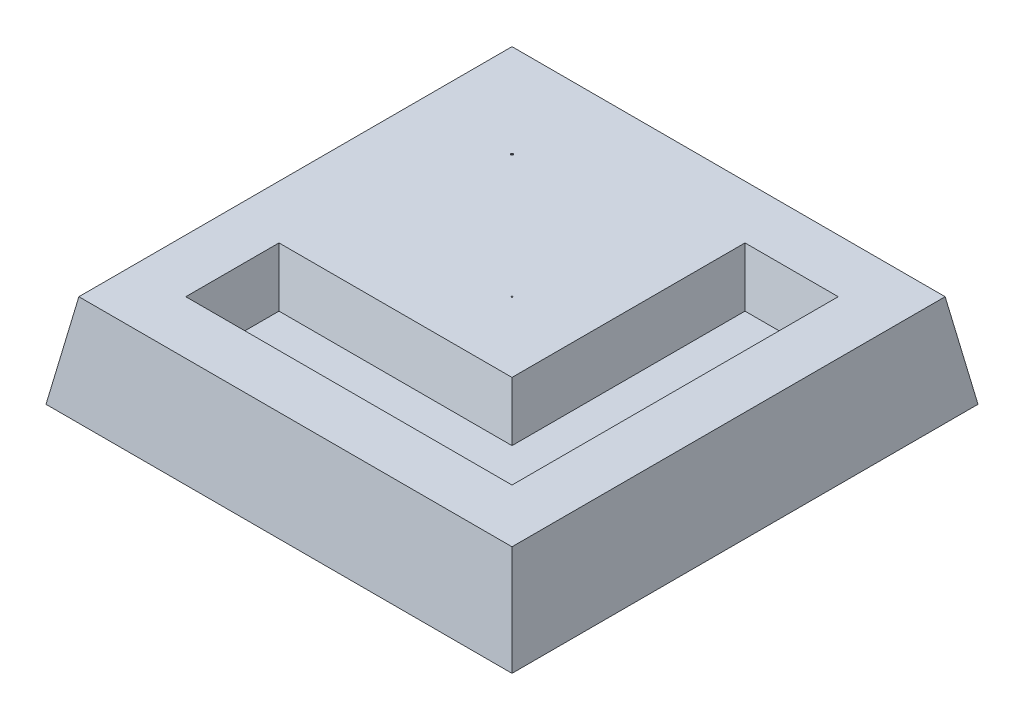
ISO-10303-21;
HEADER;
FILE_DESCRIPTION(('STEP AP214'),'2;1');
FILE_NAME('part.step','',(''),(''),'','','');
FILE_SCHEMA(('AUTOMOTIVE_DESIGN { 1 0 10303 214 1 1 1 1 }'));
ENDSEC;
DATA;
#1=APPLICATION_CONTEXT('core data for automotive mechanical design processes');
#2=APPLICATION_PROTOCOL_DEFINITION('international standard','automotive_design',2000,#1);
#3=PRODUCT_CONTEXT('',#1,'mechanical');
#4=PRODUCT('Part','Part','',(#3));
#5=PRODUCT_RELATED_PRODUCT_CATEGORY('part','',(#4));
#6=PRODUCT_DEFINITION_FORMATION('','',#4);
#7=PRODUCT_DEFINITION_CONTEXT('part definition',#1,'design');
#8=PRODUCT_DEFINITION('design','',#6,#7);
#9=PRODUCT_DEFINITION_SHAPE('','',#8);
#10=(LENGTH_UNIT() NAMED_UNIT(*) SI_UNIT(.MILLI.,.METRE.));
#11=(NAMED_UNIT(*) PLANE_ANGLE_UNIT() SI_UNIT($,.RADIAN.));
#12=(NAMED_UNIT(*) SI_UNIT($,.STERADIAN.) SOLID_ANGLE_UNIT());
#13=UNCERTAINTY_MEASURE_WITH_UNIT(LENGTH_MEASURE(1.E-05),#10,'distance_accuracy_value','');
#14=(GEOMETRIC_REPRESENTATION_CONTEXT(3) GLOBAL_UNCERTAINTY_ASSIGNED_CONTEXT((#13)) GLOBAL_UNIT_ASSIGNED_CONTEXT((#10,
#11,#12)) REPRESENTATION_CONTEXT('',''));
#15=CARTESIAN_POINT('',(0.,0.,0.));
#16=DIRECTION('',(0.,0.,1.));
#17=DIRECTION('',(1.,0.,0.));
#18=AXIS2_PLACEMENT_3D('',#15,#16,#17);
#19=CARTESIAN_POINT('',(1270.,0.,1270.));
#20=DIRECTION('',(0.984807753012208,0.173648177666931,0.));
#21=DIRECTION('',(-0.173648177666931,0.984807753012208,0.));
#22=AXIS2_PLACEMENT_3D('',#19,#20,#21);
#23=PLANE('',#22);
#24=DIRECTION('',(0.,0.,-1.));
#25=VECTOR('',#24,1.);
#26=CARTESIAN_POINT('',(1270.,0.,1270.));
#27=LINE('',#26,#25);
#28=CARTESIAN_POINT('',(1270.,0.,1270.));
#29=VERTEX_POINT('',#28);
#30=CARTESIAN_POINT('',(1270.,0.,-1270.));
#31=VERTEX_POINT('',#30);
#32=EDGE_CURVE('E159',#29,#31,#27,.T.);
#33=ORIENTED_EDGE('',*,*,#32,.T.);
#34=DIRECTION('',(0.171087869746036,-0.970287525247814,-0.171087869746036));
#35=VECTOR('',#34,1.);
#36=CARTESIAN_POINT('',(1195.65150969744,421.651241368936,-1195.65150969744));
#37=LINE('',#36,#35);
#38=CARTESIAN_POINT('',(1180.4258938001,508.,-1180.4258938001));
#39=VERTEX_POINT('',#38);
#40=EDGE_CURVE('E11',#39,#31,#37,.T.);
#41=ORIENTED_EDGE('',*,*,#40,.F.);
#42=DIRECTION('',(0.,0.,1.));
#43=VECTOR('',#42,1.);
#44=CARTESIAN_POINT('',(1180.4258938001,508.,0.));
#45=LINE('',#44,#43);
#46=CARTESIAN_POINT('',(1180.4258938001,508.,1180.4258938001));
#47=VERTEX_POINT('',#46);
#48=EDGE_CURVE('E166',#47,#39,#45,.F.);
#49=ORIENTED_EDGE('',*,*,#48,.F.);
#50=DIRECTION('',(0.171087869746036,-0.970287525247814,0.171087869746036));
#51=VECTOR('',#50,1.);
#52=CARTESIAN_POINT('',(1270.,0.,1270.));
#53=LINE('',#52,#51);
#54=EDGE_CURVE('E191',#47,#29,#53,.T.);
#55=ORIENTED_EDGE('',*,*,#54,.T.);
#56=EDGE_LOOP('',(#33,#41,#49,#55));
#57=FACE_BOUND('',#56,.T.);
#58=ADVANCED_FACE('F35',(#57),#23,.T.);
#59=CARTESIAN_POINT('',(-1270.,0.,-1270.));
#60=DIRECTION('',(0.,0.173648177666931,-0.984807753012208));
#61=DIRECTION('',(0.,0.984807753012208,0.173648177666931));
#62=AXIS2_PLACEMENT_3D('',#59,#60,#61);
#63=PLANE('',#62);
#64=DIRECTION('',(-1.,0.,0.));
#65=VECTOR('',#64,1.);
#66=CARTESIAN_POINT('',(-1270.,0.,-1270.));
#67=LINE('',#66,#65);
#68=CARTESIAN_POINT('',(-1270.,0.,-1270.));
#69=VERTEX_POINT('',#68);
#70=EDGE_CURVE('E162',#31,#69,#67,.T.);
#71=ORIENTED_EDGE('',*,*,#70,.T.);
#72=DIRECTION('',(-0.171087869746036,-0.970287525247814,-0.171087869746036));
#73=VECTOR('',#72,1.);
#74=CARTESIAN_POINT('',(-1195.65150969744,421.651241368936,-1195.65150969744));
#75=LINE('',#74,#73);
#76=CARTESIAN_POINT('',(-1180.4258938001,508.,-1180.4258938001));
#77=VERTEX_POINT('',#76);
#78=EDGE_CURVE('E45',#77,#69,#75,.T.);
#79=ORIENTED_EDGE('',*,*,#78,.F.);
#80=DIRECTION('',(1.,0.,0.));
#81=VECTOR('',#80,1.);
#82=CARTESIAN_POINT('',(0.,508.,-1180.4258938001));
#83=LINE('',#82,#81);
#84=EDGE_CURVE('E39',#39,#77,#83,.F.);
#85=ORIENTED_EDGE('',*,*,#84,.F.);
#86=ORIENTED_EDGE('',*,*,#40,.T.);
#87=EDGE_LOOP('',(#71,#79,#85,#86));
#88=FACE_BOUND('',#87,.T.);
#89=ADVANCED_FACE('F200',(#88),#63,.T.);
#90=CARTESIAN_POINT('',(-1270.,0.,1270.));
#91=DIRECTION('',(-0.984807753012208,0.173648177666931,0.));
#92=DIRECTION('',(-0.173648177666931,-0.984807753012208,0.));
#93=AXIS2_PLACEMENT_3D('',#90,#91,#92);
#94=PLANE('',#93);
#95=DIRECTION('',(0.,0.,1.));
#96=VECTOR('',#95,1.);
#97=CARTESIAN_POINT('',(-1270.,0.,1270.));
#98=LINE('',#97,#96);
#99=CARTESIAN_POINT('',(-1270.,0.,1270.));
#100=VERTEX_POINT('',#99);
#101=EDGE_CURVE('E103',#69,#100,#98,.T.);
#102=ORIENTED_EDGE('',*,*,#101,.T.);
#103=DIRECTION('',(-0.171087869746036,-0.970287525247814,0.171087869746036));
#104=VECTOR('',#103,1.);
#105=CARTESIAN_POINT('',(-1270.,0.,1270.));
#106=LINE('',#105,#104);
#107=CARTESIAN_POINT('',(-1180.4258938001,508.,1180.4258938001));
#108=VERTEX_POINT('',#107);
#109=EDGE_CURVE('E189',#108,#100,#106,.T.);
#110=ORIENTED_EDGE('',*,*,#109,.F.);
#111=DIRECTION('',(0.,0.,-1.));
#112=VECTOR('',#111,1.);
#113=CARTESIAN_POINT('',(-1180.4258938001,508.,0.));
#114=LINE('',#113,#112);
#115=EDGE_CURVE('E195',#77,#108,#114,.F.);
#116=ORIENTED_EDGE('',*,*,#115,.F.);
#117=ORIENTED_EDGE('',*,*,#78,.T.);
#118=EDGE_LOOP('',(#102,#110,#116,#117));
#119=FACE_BOUND('',#118,.T.);
#120=ADVANCED_FACE('F201',(#119),#94,.T.);
#121=CARTESIAN_POINT('',(-1270.,0.,1270.));
#122=DIRECTION('',(0.,0.173648177666931,0.984807753012208));
#123=DIRECTION('',(0.,-0.984807753012208,0.173648177666931));
#124=AXIS2_PLACEMENT_3D('',#121,#122,#123);
#125=PLANE('',#124);
#126=DIRECTION('',(1.,0.,0.));
#127=VECTOR('',#126,1.);
#128=CARTESIAN_POINT('',(-1270.,0.,1270.));
#129=LINE('',#128,#127);
#130=EDGE_CURVE('E95',#100,#29,#129,.T.);
#131=ORIENTED_EDGE('',*,*,#130,.T.);
#132=ORIENTED_EDGE('',*,*,#54,.F.);
#133=DIRECTION('',(-1.,0.,0.));
#134=VECTOR('',#133,1.);
#135=CARTESIAN_POINT('',(0.,508.,1180.4258938001));
#136=LINE('',#135,#134);
#137=EDGE_CURVE('E194',#108,#47,#136,.F.);
#138=ORIENTED_EDGE('',*,*,#137,.F.);
#139=ORIENTED_EDGE('',*,*,#109,.T.);
#140=EDGE_LOOP('',(#131,#132,#138,#139));
#141=FACE_BOUND('',#140,.T.);
#142=ADVANCED_FACE('F37',(#141),#125,.T.);
#143=CARTESIAN_POINT('',(0.,508.,0.));
#144=DIRECTION('',(0.,-1.,0.));
#145=DIRECTION('',(0.,0.,-1.));
#146=AXIS2_PLACEMENT_3D('',#143,#144,#145);
#147=PLANE('',#146);
#148=CARTESIAN_POINT('',(0.,508.,0.));
#149=DIRECTION('',(0.,1.,0.));
#150=DIRECTION('',(0.,0.,1.));
#151=AXIS2_PLACEMENT_3D('',#148,#149,#150);
#152=CIRCLE('',#151,3.99999999999999);
#153=CARTESIAN_POINT('',(0.,508.,3.99999999999999));
#154=VERTEX_POINT('',#153);
#155=EDGE_CURVE('E274',#154,#154,#152,.T.);
#156=ORIENTED_EDGE('',*,*,#155,.F.);
#157=EDGE_LOOP('',(#156));
#158=FACE_BOUND('',#157,.T.);
#159=CARTESIAN_POINT('',(-672.425893800099,508.,-672.4258938001));
#160=DIRECTION('',(0.,1.,0.));
#161=DIRECTION('',(0.,0.,1.));
#162=AXIS2_PLACEMENT_3D('',#159,#160,#161);
#163=CIRCLE('',#162,6.12000000000001);
#164=CARTESIAN_POINT('',(-672.425893800099,508.,-666.3058938001));
#165=VERTEX_POINT('',#164);
#166=EDGE_CURVE('E276',#165,#165,#163,.T.);
#167=ORIENTED_EDGE('',*,*,#166,.F.);
#168=EDGE_LOOP('',(#167));
#169=FACE_BOUND('',#168,.T.);
#170=DIRECTION('',(0.,0.,1.));
#171=VECTOR('',#170,1.);
#172=CARTESIAN_POINT('',(381.,508.,-889.));
#173=LINE('',#172,#171);
#174=CARTESIAN_POINT('',(381.,508.,-889.));
#175=VERTEX_POINT('',#174);
#176=CARTESIAN_POINT('',(381.000000000001,508.,381.));
#177=VERTEX_POINT('',#176);
#178=EDGE_CURVE('E139',#175,#177,#173,.T.);
#179=ORIENTED_EDGE('',*,*,#178,.F.);
#180=DIRECTION('',(-1.,0.,0.));
#181=VECTOR('',#180,1.);
#182=CARTESIAN_POINT('',(889.000000000001,508.,-889.));
#183=LINE('',#182,#181);
#184=CARTESIAN_POINT('',(889.000000000001,508.,-889.));
#185=VERTEX_POINT('',#184);
#186=EDGE_CURVE('E54',#185,#175,#183,.T.);
#187=ORIENTED_EDGE('',*,*,#186,.F.);
#188=DIRECTION('',(0.,0.,-1.));
#189=VECTOR('',#188,1.);
#190=CARTESIAN_POINT('',(889.000000000001,508.,889.));
#191=LINE('',#190,#189);
#192=CARTESIAN_POINT('',(889.000000000001,508.,889.));
#193=VERTEX_POINT('',#192);
#194=EDGE_CURVE('E155',#193,#185,#191,.T.);
#195=ORIENTED_EDGE('',*,*,#194,.F.);
#196=DIRECTION('',(1.,0.,0.));
#197=VECTOR('',#196,1.);
#198=CARTESIAN_POINT('',(-888.999999999999,508.,889.));
#199=LINE('',#198,#197);
#200=CARTESIAN_POINT('',(-888.999999999999,508.,889.));
#201=VERTEX_POINT('',#200);
#202=EDGE_CURVE('E149',#201,#193,#199,.T.);
#203=ORIENTED_EDGE('',*,*,#202,.F.);
#204=DIRECTION('',(0.,0.,1.));
#205=VECTOR('',#204,1.);
#206=CARTESIAN_POINT('',(-888.999999999999,508.,381.));
#207=LINE('',#206,#205);
#208=CARTESIAN_POINT('',(-888.999999999999,508.,381.));
#209=VERTEX_POINT('',#208);
#210=EDGE_CURVE('E147',#209,#201,#207,.T.);
#211=ORIENTED_EDGE('',*,*,#210,.F.);
#212=DIRECTION('',(-1.,0.,0.));
#213=VECTOR('',#212,1.);
#214=CARTESIAN_POINT('',(381.000000000001,508.,381.));
#215=LINE('',#214,#213);
#216=EDGE_CURVE('E128',#177,#209,#215,.T.);
#217=ORIENTED_EDGE('',*,*,#216,.F.);
#218=EDGE_LOOP('',(#179,#187,#195,#203,#211,#217));
#219=FACE_BOUND('',#218,.T.);
#220=ORIENTED_EDGE('',*,*,#48,.T.);
#221=ORIENTED_EDGE('',*,*,#84,.T.);
#222=ORIENTED_EDGE('',*,*,#115,.T.);
#223=ORIENTED_EDGE('',*,*,#137,.T.);
#224=EDGE_LOOP('',(#220,#221,#222,#223));
#225=FACE_BOUND('',#224,.T.);
#226=ADVANCED_FACE('F143',(#158,#169,#219,#225),#147,.F.);
#227=CARTESIAN_POINT('',(0.,0.,0.));
#228=DIRECTION('',(0.,-1.,0.));
#229=DIRECTION('',(0.,0.,-1.));
#230=AXIS2_PLACEMENT_3D('',#227,#228,#229);
#231=PLANE('',#230);
#232=CARTESIAN_POINT('',(0.,0.,0.));
#233=DIRECTION('',(0.,1.,0.));
#234=DIRECTION('',(0.,0.,1.));
#235=AXIS2_PLACEMENT_3D('',#232,#233,#234);
#236=CIRCLE('',#235,3.99999999999992);
#237=CARTESIAN_POINT('',(0.,0.,3.99999999999992));
#238=VERTEX_POINT('',#237);
#239=EDGE_CURVE('E271',#238,#238,#236,.T.);
#240=ORIENTED_EDGE('',*,*,#239,.T.);
#241=EDGE_LOOP('',(#240));
#242=FACE_BOUND('',#241,.T.);
#243=CARTESIAN_POINT('',(-672.425893800099,0.,-672.4258938001));
#244=DIRECTION('',(0.,1.,0.));
#245=DIRECTION('',(0.,0.,1.));
#246=AXIS2_PLACEMENT_3D('',#243,#244,#245);
#247=CIRCLE('',#246,2.8999999999999);
#248=CARTESIAN_POINT('',(-672.425893800099,0.,-669.5258938001));
#249=VERTEX_POINT('',#248);
#250=EDGE_CURVE('E287',#249,#249,#247,.T.);
#251=ORIENTED_EDGE('',*,*,#250,.T.);
#252=EDGE_LOOP('',(#251));
#253=FACE_BOUND('',#252,.T.);
#254=ORIENTED_EDGE('',*,*,#32,.F.);
#255=ORIENTED_EDGE('',*,*,#130,.F.);
#256=ORIENTED_EDGE('',*,*,#101,.F.);
#257=ORIENTED_EDGE('',*,*,#70,.F.);
#258=EDGE_LOOP('',(#254,#255,#256,#257));
#259=FACE_BOUND('',#258,.T.);
#260=ADVANCED_FACE('F206',(#242,#253,#259),#231,.T.);
#261=CARTESIAN_POINT('',(889.000000000001,508.,-889.));
#262=DIRECTION('',(0.,0.258819045102521,0.965925826289068));
#263=DIRECTION('',(0.,-0.965925826289068,0.258819045102521));
#264=AXIS2_PLACEMENT_3D('',#261,#262,#263);
#265=PLANE('',#264);
#266=ORIENTED_EDGE('',*,*,#186,.T.);
#267=DIRECTION('',(-0.250562807085732,0.935113126531029,-0.250562807085732));
#268=VECTOR('',#267,1.);
#269=CARTESIAN_POINT('',(412.893113909699,388.973278477424,-857.106886090302));
#270=LINE('',#269,#268);
#271=CARTESIAN_POINT('',(449.059094877506,254.,-820.940905122495));
#272=VERTEX_POINT('',#271);
#273=EDGE_CURVE('E136',#272,#175,#270,.T.);
#274=ORIENTED_EDGE('',*,*,#273,.F.);
#275=DIRECTION('',(1.,0.,0.));
#276=VECTOR('',#275,1.);
#277=CARTESIAN_POINT('',(0.,254.,-820.940905122495));
#278=LINE('',#277,#276);
#279=CARTESIAN_POINT('',(820.940905122495,254.,-820.940905122495));
#280=VERTEX_POINT('',#279);
#281=EDGE_CURVE('E158',#280,#272,#278,.F.);
#282=ORIENTED_EDGE('',*,*,#281,.F.);
#283=DIRECTION('',(0.250562807085732,0.935113126531029,-0.250562807085732));
#284=VECTOR('',#283,1.);
#285=CARTESIAN_POINT('',(777.374101316057,91.4064746709854,-777.374101316056));
#286=LINE('',#285,#284);
#287=EDGE_CURVE('E163',#280,#185,#286,.T.);
#288=ORIENTED_EDGE('',*,*,#287,.T.);
#289=EDGE_LOOP('',(#266,#274,#282,#288));
#290=FACE_BOUND('',#289,.T.);
#291=ADVANCED_FACE('F208',(#290),#265,.T.);
#292=CARTESIAN_POINT('',(889.000000000001,508.,889.));
#293=DIRECTION('',(-0.965925826289068,0.258819045102521,0.));
#294=DIRECTION('',(-0.258819045102521,-0.965925826289068,0.));
#295=AXIS2_PLACEMENT_3D('',#292,#293,#294);
#296=PLANE('',#295);
#297=ORIENTED_EDGE('',*,*,#194,.T.);
#298=ORIENTED_EDGE('',*,*,#287,.F.);
#299=DIRECTION('',(0.,0.,1.));
#300=VECTOR('',#299,1.);
#301=CARTESIAN_POINT('',(820.940905122495,254.,0.));
#302=LINE('',#301,#300);
#303=CARTESIAN_POINT('',(820.940905122495,254.,820.940905122495));
#304=VERTEX_POINT('',#303);
#305=EDGE_CURVE('E169',#304,#280,#302,.F.);
#306=ORIENTED_EDGE('',*,*,#305,.F.);
#307=DIRECTION('',(0.250562807085732,0.935113126531029,0.250562807085732));
#308=VECTOR('',#307,1.);
#309=CARTESIAN_POINT('',(777.374101316056,91.4064746709855,777.374101316056));
#310=LINE('',#309,#308);
#311=EDGE_CURVE('E171',#304,#193,#310,.T.);
#312=ORIENTED_EDGE('',*,*,#311,.T.);
#313=EDGE_LOOP('',(#297,#298,#306,#312));
#314=FACE_BOUND('',#313,.T.);
#315=ADVANCED_FACE('F215',(#314),#296,.T.);
#316=CARTESIAN_POINT('',(-888.999999999999,508.,889.));
#317=DIRECTION('',(0.,0.258819045102521,-0.965925826289068));
#318=DIRECTION('',(0.,0.965925826289068,0.258819045102521));
#319=AXIS2_PLACEMENT_3D('',#316,#317,#318);
#320=PLANE('',#319);
#321=ORIENTED_EDGE('',*,*,#202,.T.);
#322=ORIENTED_EDGE('',*,*,#311,.F.);
#323=DIRECTION('',(-1.,0.,0.));
#324=VECTOR('',#323,1.);
#325=CARTESIAN_POINT('',(0.,254.,820.940905122495));
#326=LINE('',#325,#324);
#327=CARTESIAN_POINT('',(-820.940905122494,254.,820.940905122495));
#328=VERTEX_POINT('',#327);
#329=EDGE_CURVE('E182',#328,#304,#326,.F.);
#330=ORIENTED_EDGE('',*,*,#329,.F.);
#331=DIRECTION('',(-0.250562807085732,0.935113126531029,0.250562807085732));
#332=VECTOR('',#331,1.);
#333=CARTESIAN_POINT('',(-857.106886090301,388.973278477424,857.106886090302));
#334=LINE('',#333,#332);
#335=EDGE_CURVE('E173',#328,#201,#334,.T.);
#336=ORIENTED_EDGE('',*,*,#335,.T.);
#337=EDGE_LOOP('',(#321,#322,#330,#336));
#338=FACE_BOUND('',#337,.T.);
#339=ADVANCED_FACE('F235',(#338),#320,.T.);
#340=CARTESIAN_POINT('',(-888.999999999999,508.,381.));
#341=DIRECTION('',(0.965925826289068,0.258819045102521,0.));
#342=DIRECTION('',(-0.258819045102521,0.965925826289068,0.));
#343=AXIS2_PLACEMENT_3D('',#340,#341,#342);
#344=PLANE('',#343);
#345=ORIENTED_EDGE('',*,*,#210,.T.);
#346=ORIENTED_EDGE('',*,*,#335,.F.);
#347=DIRECTION('',(0.,0.,-1.));
#348=VECTOR('',#347,1.);
#349=CARTESIAN_POINT('',(-820.940905122494,254.,1.79414861166065E-13));
#350=LINE('',#349,#348);
#351=CARTESIAN_POINT('',(-820.940905122494,254.,449.059094877505));
#352=VERTEX_POINT('',#351);
#353=EDGE_CURVE('E179',#352,#328,#350,.F.);
#354=ORIENTED_EDGE('',*,*,#353,.F.);
#355=DIRECTION('',(-0.250562807085732,0.935113126531029,-0.250562807085732));
#356=VECTOR('',#355,1.);
#357=CARTESIAN_POINT('',(-809.267215225753,210.433196193561,460.732784774246));
#358=LINE('',#357,#356);
#359=EDGE_CURVE('E135',#352,#209,#358,.T.);
#360=ORIENTED_EDGE('',*,*,#359,.T.);
#361=EDGE_LOOP('',(#345,#346,#354,#360));
#362=FACE_BOUND('',#361,.T.);
#363=ADVANCED_FACE('F232',(#362),#344,.T.);
#364=CARTESIAN_POINT('',(381.000000000001,508.,381.));
#365=DIRECTION('',(0.,0.258819045102521,0.965925826289068));
#366=DIRECTION('',(0.,-0.965925826289068,0.258819045102521));
#367=AXIS2_PLACEMENT_3D('',#364,#365,#366);
#368=PLANE('',#367);
#369=ORIENTED_EDGE('',*,*,#216,.T.);
#370=ORIENTED_EDGE('',*,*,#359,.F.);
#371=DIRECTION('',(1.,0.,0.));
#372=VECTOR('',#371,1.);
#373=CARTESIAN_POINT('',(0.,254.,449.059094877505));
#374=LINE('',#373,#372);
#375=CARTESIAN_POINT('',(449.059094877506,254.,449.059094877505));
#376=VERTEX_POINT('',#375);
#377=EDGE_CURVE('E131',#376,#352,#374,.F.);
#378=ORIENTED_EDGE('',*,*,#377,.F.);
#379=DIRECTION('',(-0.250562807085732,0.935113126531029,-0.250562807085732));
#380=VECTOR('',#379,1.);
#381=CARTESIAN_POINT('',(381.000000000001,508.,381.));
#382=LINE('',#381,#380);
#383=EDGE_CURVE('E124',#376,#177,#382,.T.);
#384=ORIENTED_EDGE('',*,*,#383,.T.);
#385=EDGE_LOOP('',(#369,#370,#378,#384));
#386=FACE_BOUND('',#385,.T.);
#387=ADVANCED_FACE('F126',(#386),#368,.T.);
#388=CARTESIAN_POINT('',(381.,508.,-889.));
#389=DIRECTION('',(0.965925826289068,0.258819045102521,0.));
#390=DIRECTION('',(-0.258819045102521,0.965925826289068,0.));
#391=AXIS2_PLACEMENT_3D('',#388,#389,#390);
#392=PLANE('',#391);
#393=ORIENTED_EDGE('',*,*,#178,.T.);
#394=ORIENTED_EDGE('',*,*,#383,.F.);
#395=DIRECTION('',(0.,0.,-1.));
#396=VECTOR('',#395,1.);
#397=CARTESIAN_POINT('',(449.059094877506,254.,0.));
#398=LINE('',#397,#396);
#399=EDGE_CURVE('E176',#272,#376,#398,.F.);
#400=ORIENTED_EDGE('',*,*,#399,.F.);
#401=ORIENTED_EDGE('',*,*,#273,.T.);
#402=EDGE_LOOP('',(#393,#394,#400,#401));
#403=FACE_BOUND('',#402,.T.);
#404=ADVANCED_FACE('F140',(#403),#392,.T.);
#405=CARTESIAN_POINT('',(0.,254.,0.));
#406=DIRECTION('',(0.,1.,0.));
#407=DIRECTION('',(0.,0.,1.));
#408=AXIS2_PLACEMENT_3D('',#405,#406,#407);
#409=PLANE('',#408);
#410=ORIENTED_EDGE('',*,*,#281,.T.);
#411=ORIENTED_EDGE('',*,*,#399,.T.);
#412=ORIENTED_EDGE('',*,*,#377,.T.);
#413=ORIENTED_EDGE('',*,*,#353,.T.);
#414=ORIENTED_EDGE('',*,*,#329,.T.);
#415=ORIENTED_EDGE('',*,*,#305,.T.);
#416=EDGE_LOOP('',(#410,#411,#412,#413,#414,#415));
#417=FACE_BOUND('',#416,.T.);
#418=ADVANCED_FACE('F243',(#417),#409,.T.);
#419=CARTESIAN_POINT('',(-672.425893800099,508.,-672.4258938001));
#420=DIRECTION('',(0.,1.,0.));
#421=DIRECTION('',(0.,0.,1.));
#422=AXIS2_PLACEMENT_3D('',#419,#420,#421);
#423=CYLINDRICAL_SURFACE('',#422,2.89999999999996);
#424=ORIENTED_EDGE('',*,*,#250,.F.);
#425=EDGE_LOOP('',(#424));
#426=FACE_BOUND('',#425,.T.);
#427=CARTESIAN_POINT('',(-672.425893800099,502.35,-672.4258938001));
#428=DIRECTION('',(0.,1.,0.));
#429=DIRECTION('',(0.,0.,1.));
#430=AXIS2_PLACEMENT_3D('',#427,#428,#429);
#431=CIRCLE('',#430,2.90000000000001);
#432=CARTESIAN_POINT('',(-672.425893800099,502.35,-669.5258938001));
#433=VERTEX_POINT('',#432);
#434=EDGE_CURVE('E284',#433,#433,#431,.T.);
#435=ORIENTED_EDGE('',*,*,#434,.T.);
#436=EDGE_LOOP('',(#435));
#437=FACE_BOUND('',#436,.T.);
#438=ADVANCED_FACE('F247',(#426,#437),#423,.F.);
#439=CARTESIAN_POINT('',(-669.525893800099,502.35,-672.4258938001));
#440=DIRECTION('',(0.,-1.,0.));
#441=DIRECTION('',(0.,0.,-1.));
#442=AXIS2_PLACEMENT_3D('',#439,#440,#441);
#443=PLANE('',#442);
#444=ORIENTED_EDGE('',*,*,#434,.F.);
#445=EDGE_LOOP('',(#444));
#446=FACE_BOUND('',#445,.T.);
#447=CARTESIAN_POINT('',(-672.425893800099,502.35,-672.4258938001));
#448=DIRECTION('',(0.,1.,0.));
#449=DIRECTION('',(0.,0.,1.));
#450=AXIS2_PLACEMENT_3D('',#447,#448,#449);
#451=CIRCLE('',#450,6.12000000000001);
#452=CARTESIAN_POINT('',(-672.425893800099,502.35,-666.3058938001));
#453=VERTEX_POINT('',#452);
#454=EDGE_CURVE('E281',#453,#453,#451,.T.);
#455=ORIENTED_EDGE('',*,*,#454,.T.);
#456=EDGE_LOOP('',(#455));
#457=FACE_BOUND('',#456,.T.);
#458=ADVANCED_FACE('F253',(#446,#457),#443,.F.);
#459=CARTESIAN_POINT('',(-672.425893800099,508.,-672.4258938001));
#460=DIRECTION('',(0.,1.,0.));
#461=DIRECTION('',(0.,0.,1.));
#462=AXIS2_PLACEMENT_3D('',#459,#460,#461);
#463=CYLINDRICAL_SURFACE('',#462,6.12000000000001);
#464=ORIENTED_EDGE('',*,*,#454,.F.);
#465=EDGE_LOOP('',(#464));
#466=FACE_BOUND('',#465,.T.);
#467=ORIENTED_EDGE('',*,*,#166,.T.);
#468=EDGE_LOOP('',(#467));
#469=FACE_BOUND('',#468,.T.);
#470=ADVANCED_FACE('F259',(#466,#469),#463,.F.);
#471=CARTESIAN_POINT('',(0.,508.,0.));
#472=DIRECTION('',(0.,1.,0.));
#473=DIRECTION('',(0.,0.,1.));
#474=AXIS2_PLACEMENT_3D('',#471,#472,#473);
#475=CYLINDRICAL_SURFACE('',#474,3.99999999999995);
#476=ORIENTED_EDGE('',*,*,#239,.F.);
#477=EDGE_LOOP('',(#476));
#478=FACE_BOUND('',#477,.T.);
#479=ORIENTED_EDGE('',*,*,#155,.T.);
#480=EDGE_LOOP('',(#479));
#481=FACE_BOUND('',#480,.T.);
#482=ADVANCED_FACE('F263',(#478,#481),#475,.F.);
#483=CLOSED_SHELL('',(#58,#89,#120,#142,#226,#260,#291,#315,#339,#363,#387,#404,#418,#438,#458,
#470,#482));
#484=MANIFOLD_SOLID_BREP('B2',#483);
#485=ADVANCED_BREP_SHAPE_REPRESENTATION('',(#18,#484),#14);
#486=SHAPE_DEFINITION_REPRESENTATION(#9,#485);
ENDSEC;
END-ISO-10303-21;
